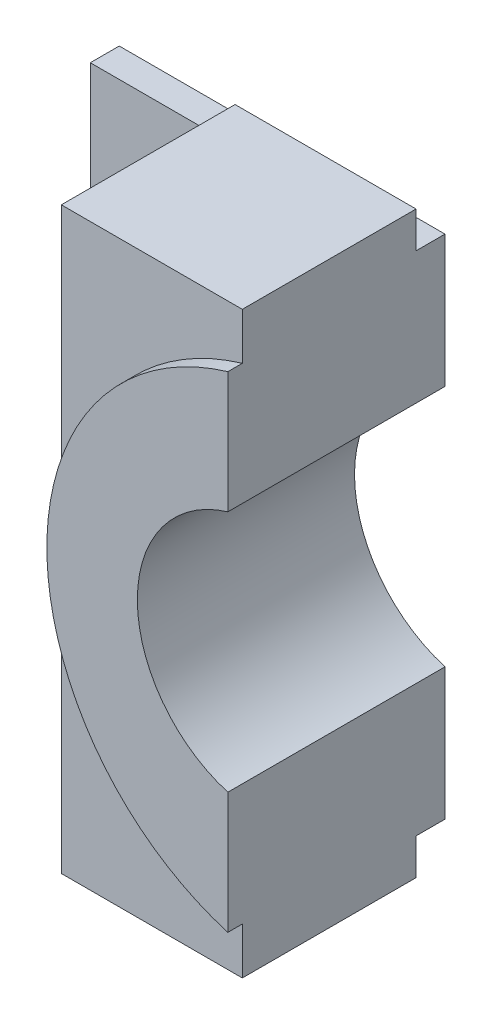
ISO-10303-21;
HEADER;
FILE_DESCRIPTION(('STEP AP214'),'2;1');
FILE_NAME('part.step','',(''),(''),'','','');
FILE_SCHEMA(('AUTOMOTIVE_DESIGN { 1 0 10303 214 1 1 1 1 }'));
ENDSEC;
DATA;
#1=APPLICATION_CONTEXT('core data for automotive mechanical design processes');
#2=APPLICATION_PROTOCOL_DEFINITION('international standard','automotive_design',2000,#1);
#3=PRODUCT_CONTEXT('',#1,'mechanical');
#4=PRODUCT('Part','Part','',(#3));
#5=PRODUCT_RELATED_PRODUCT_CATEGORY('part','',(#4));
#6=PRODUCT_DEFINITION_FORMATION('','',#4);
#7=PRODUCT_DEFINITION_CONTEXT('part definition',#1,'design');
#8=PRODUCT_DEFINITION('design','',#6,#7);
#9=PRODUCT_DEFINITION_SHAPE('','',#8);
#10=(LENGTH_UNIT() NAMED_UNIT(*) SI_UNIT(.MILLI.,.METRE.));
#11=(NAMED_UNIT(*) PLANE_ANGLE_UNIT() SI_UNIT($,.RADIAN.));
#12=(NAMED_UNIT(*) SI_UNIT($,.STERADIAN.) SOLID_ANGLE_UNIT());
#13=UNCERTAINTY_MEASURE_WITH_UNIT(LENGTH_MEASURE(1.E-05),#10,'distance_accuracy_value','');
#14=(GEOMETRIC_REPRESENTATION_CONTEXT(3) GLOBAL_UNCERTAINTY_ASSIGNED_CONTEXT((#13)) GLOBAL_UNIT_ASSIGNED_CONTEXT((#10,
#11,#12)) REPRESENTATION_CONTEXT('',''));
#15=CARTESIAN_POINT('',(0.,0.,0.));
#16=DIRECTION('',(0.,0.,1.));
#17=DIRECTION('',(1.,0.,0.));
#18=AXIS2_PLACEMENT_3D('',#15,#16,#17);
#19=CARTESIAN_POINT('',(2.14999999961,9.70000000075,0.997560739801));
#20=DIRECTION('',(0.,0.,1.));
#21=DIRECTION('',(1.,8.1660348554033E-12,0.));
#22=AXIS2_PLACEMENT_3D('',#19,#20,#21);
#23=CYLINDRICAL_SURFACE('',#22,0.175);
#24=CARTESIAN_POINT('',(2.14999999961,9.70000000075,0.0199999999183009));
#25=DIRECTION('',(4.66852296906889E-10,6.26358125195821E-10,1.));
#26=DIRECTION('',(-1.,0.,4.66852296906889E-10));
#27=AXIS2_PLACEMENT_3D('',#24,#25,#26);
#28=CIRCLE('',#27,0.175);
#29=CARTESIAN_POINT('',(2.09999999961,9.86770509854,0.0199999992549));
#30=VERTEX_POINT('',#29);
#31=CARTESIAN_POINT('',(2.09999999961,9.53229490221,0.0199999992549));
#32=VERTEX_POINT('',#31);
#33=EDGE_CURVE('E11',#30,#32,#28,.T.);
#34=ORIENTED_EDGE('',*,*,#33,.F.);
#35=DIRECTION('',(0.,0.,1.));
#36=VECTOR('',#35,1.);
#37=CARTESIAN_POINT('',(2.09999999961,9.86770509906,0.997560739517));
#38=LINE('',#37,#36);
#39=CARTESIAN_POINT('',(2.09999999961,9.86770509854,0.32));
#40=VERTEX_POINT('',#39);
#41=EDGE_CURVE('E25',#30,#40,#38,.T.);
#42=ORIENTED_EDGE('',*,*,#41,.T.);
#43=CARTESIAN_POINT('',(2.14999999961,9.70000000075,0.320000000291));
#44=DIRECTION('',(-1.66285715355991E-09,-2.23095698132496E-09,1.));
#45=DIRECTION('',(-1.,0.,-1.66285715355991E-09));
#46=AXIS2_PLACEMENT_3D('',#43,#44,#45);
#47=CIRCLE('',#46,0.175);
#48=CARTESIAN_POINT('',(2.09999999961,9.53229490221,0.32));
#49=VERTEX_POINT('',#48);
#50=EDGE_CURVE('E291',#40,#49,#47,.T.);
#51=ORIENTED_EDGE('',*,*,#50,.T.);
#52=DIRECTION('',(0.,0.,1.));
#53=VECTOR('',#52,1.);
#54=CARTESIAN_POINT('',(2.09999999961,9.53229490243,0.997560739517));
#55=LINE('',#54,#53);
#56=EDGE_CURVE('E286',#32,#49,#55,.T.);
#57=ORIENTED_EDGE('',*,*,#56,.F.);
#58=EDGE_LOOP('',(#34,#42,#51,#57));
#59=FACE_BOUND('',#58,.T.);
#60=ADVANCED_FACE('F17',(#59),#23,.F.);
#61=CARTESIAN_POINT('',(2.09999999961,9.35000000075,0.32));
#62=DIRECTION('',(-1.,0.,0.));
#63=DIRECTION('',(0.,0.,-1.));
#64=AXIS2_PLACEMENT_3D('',#61,#62,#63);
#65=PLANE('',#64);
#66=DIRECTION('',(-2.35471780962726E-08,7.02043978506594E-09,-1.));
#67=VECTOR('',#66,1.);
#68=CARTESIAN_POINT('',(2.10000000008232,9.36458980398421,0.32));
#69=LINE('',#68,#67);
#70=CARTESIAN_POINT('',(2.09999999961,9.36458980412,0.32));
#71=VERTEX_POINT('',#70);
#72=CARTESIAN_POINT('',(2.09999999961,9.36458980412,0.3));
#73=VERTEX_POINT('',#72);
#74=EDGE_CURVE('E282',#71,#73,#69,.T.);
#75=ORIENTED_EDGE('',*,*,#74,.T.);
#76=DIRECTION('',(0.,1.,0.));
#77=VECTOR('',#76,1.);
#78=CARTESIAN_POINT('',(2.09999999961,9.33229490206,0.3));
#79=LINE('',#78,#77);
#80=CARTESIAN_POINT('',(2.09999999961,9.3,0.3));
#81=VERTEX_POINT('',#80);
#82=EDGE_CURVE('E277',#81,#73,#79,.T.);
#83=ORIENTED_EDGE('',*,*,#82,.F.);
#84=DIRECTION('',(0.,0.,-1.));
#85=VECTOR('',#84,1.);
#86=CARTESIAN_POINT('',(2.09999999961,9.3,0.180000000112));
#87=LINE('',#86,#85);
#88=CARTESIAN_POINT('',(2.09999999961,9.3,0.0600000002235));
#89=VERTEX_POINT('',#88);
#90=EDGE_CURVE('E273',#81,#89,#87,.T.);
#91=ORIENTED_EDGE('',*,*,#90,.T.);
#92=DIRECTION('',(0.,1.,0.));
#93=VECTOR('',#92,1.);
#94=CARTESIAN_POINT('',(2.09999999961,9.32500000037,0.06));
#95=LINE('',#94,#93);
#96=CARTESIAN_POINT('',(2.09999999961,9.35000000075,0.0600000002235));
#97=VERTEX_POINT('',#96);
#98=EDGE_CURVE('E269',#89,#97,#95,.T.);
#99=ORIENTED_EDGE('',*,*,#98,.T.);
#100=DIRECTION('',(0.,0.,-1.));
#101=VECTOR('',#100,1.);
#102=CARTESIAN_POINT('',(2.09999999961,9.35000000075,0.0399999997392));
#103=LINE('',#102,#101);
#104=CARTESIAN_POINT('',(2.09999999961,9.35000000099667,0.0199999997516333));
#105=VERTEX_POINT('',#104);
#106=EDGE_CURVE('E265',#97,#105,#103,.T.);
#107=ORIENTED_EDGE('',*,*,#106,.T.);
#108=DIRECTION('',(0.,1.,0.));
#109=VECTOR('',#108,1.);
#110=CARTESIAN_POINT('',(2.09999999961,9.44114745222,0.02));
#111=LINE('',#110,#109);
#112=EDGE_CURVE('E260',#105,#32,#111,.T.);
#113=ORIENTED_EDGE('',*,*,#112,.T.);
#114=ORIENTED_EDGE('',*,*,#56,.T.);
#115=DIRECTION('',(0.,1.,0.));
#116=VECTOR('',#115,1.);
#117=CARTESIAN_POINT('',(2.09999999961,9.44844235279,0.32));
#118=LINE('',#117,#116);
#119=EDGE_CURVE('E255',#71,#49,#118,.T.);
#120=ORIENTED_EDGE('',*,*,#119,.F.);
#121=EDGE_LOOP('',(#75,#83,#91,#99,#107,#113,#114,#120));
#122=FACE_BOUND('',#121,.T.);
#123=ADVANCED_FACE('F305',(#122),#65,.F.);
#124=CARTESIAN_POINT('',(2.09999999961,10.0500000007,0.32));
#125=DIRECTION('',(0.,0.,1.));
#126=DIRECTION('',(-1.,0.,0.));
#127=AXIS2_PLACEMENT_3D('',#124,#125,#126);
#128=PLANE('',#127);
#129=CARTESIAN_POINT('',(2.19999999961,9.70000000075,0.32));
#130=DIRECTION('',(0.,0.,1.));
#131=DIRECTION('',(-1.,0.,0.));
#132=AXIS2_PLACEMENT_3D('',#129,#130,#131);
#133=CIRCLE('',#132,0.35);
#134=CARTESIAN_POINT('',(2.09999999961,10.0354101974,0.32));
#135=VERTEX_POINT('',#134);
#136=EDGE_CURVE('E250',#135,#71,#133,.T.);
#137=ORIENTED_EDGE('',*,*,#136,.T.);
#138=ORIENTED_EDGE('',*,*,#119,.T.);
#139=ORIENTED_EDGE('',*,*,#50,.F.);
#140=DIRECTION('',(0.,1.,0.));
#141=VECTOR('',#140,1.);
#142=CARTESIAN_POINT('',(2.09999999961,9.9515576487,0.32));
#143=LINE('',#142,#141);
#144=EDGE_CURVE('E246',#40,#135,#143,.T.);
#145=ORIENTED_EDGE('',*,*,#144,.T.);
#146=EDGE_LOOP('',(#137,#138,#139,#145));
#147=FACE_BOUND('',#146,.T.);
#148=ADVANCED_FACE('F301',(#147),#128,.T.);
#149=CARTESIAN_POINT('',(2.09999999961,9.35000000075,0.32));
#150=DIRECTION('',(-1.,0.,0.));
#151=DIRECTION('',(0.,0.,-1.));
#152=AXIS2_PLACEMENT_3D('',#149,#150,#151);
#153=PLANE('',#152);
#154=DIRECTION('',(0.,1.,0.));
#155=VECTOR('',#154,1.);
#156=CARTESIAN_POINT('',(2.09999999961,10.0677050991,0.3));
#157=LINE('',#156,#155);
#158=CARTESIAN_POINT('',(2.09999999961,10.0354101974,0.3));
#159=VERTEX_POINT('',#158);
#160=CARTESIAN_POINT('',(2.09999999961,10.1000000007,0.3));
#161=VERTEX_POINT('',#160);
#162=EDGE_CURVE('E241',#159,#161,#157,.T.);
#163=ORIENTED_EDGE('',*,*,#162,.F.);
#164=DIRECTION('',(0.,5.67865754419E-09,-1.));
#165=VECTOR('',#164,1.);
#166=CARTESIAN_POINT('',(2.09999999961,10.0354101973,0.31));
#167=LINE('',#166,#165);
#168=EDGE_CURVE('E236',#135,#159,#167,.T.);
#169=ORIENTED_EDGE('',*,*,#168,.F.);
#170=ORIENTED_EDGE('',*,*,#144,.F.);
#171=ORIENTED_EDGE('',*,*,#41,.F.);
#172=DIRECTION('',(0.,1.,0.));
#173=VECTOR('',#172,1.);
#174=CARTESIAN_POINT('',(2.09999999961,9.95885255001,0.02));
#175=LINE('',#174,#173);
#176=CARTESIAN_POINT('',(2.09999999961,10.0500000004667,0.0199999997516333));
#177=VERTEX_POINT('',#176);
#178=EDGE_CURVE('E232',#30,#177,#175,.T.);
#179=ORIENTED_EDGE('',*,*,#178,.T.);
#180=DIRECTION('',(0.,0.,-1.));
#181=VECTOR('',#180,1.);
#182=CARTESIAN_POINT('',(2.09999999961,10.0500000007,0.0399999997392));
#183=LINE('',#182,#181);
#184=CARTESIAN_POINT('',(2.09999999961,10.05,0.0600000002235));
#185=VERTEX_POINT('',#184);
#186=EDGE_CURVE('E228',#185,#177,#183,.T.);
#187=ORIENTED_EDGE('',*,*,#186,.F.);
#188=DIRECTION('',(0.,1.,0.));
#189=VECTOR('',#188,1.);
#190=CARTESIAN_POINT('',(2.09999999961,10.0750000004,0.06));
#191=LINE('',#190,#189);
#192=CARTESIAN_POINT('',(2.09999999961,10.1000000007,0.0600000002235));
#193=VERTEX_POINT('',#192);
#194=EDGE_CURVE('E224',#185,#193,#191,.T.);
#195=ORIENTED_EDGE('',*,*,#194,.T.);
#196=DIRECTION('',(0.,0.,-1.));
#197=VECTOR('',#196,1.);
#198=CARTESIAN_POINT('',(2.09999999961,10.1000000007,0.180000000112));
#199=LINE('',#198,#197);
#200=EDGE_CURVE('E219',#161,#193,#199,.T.);
#201=ORIENTED_EDGE('',*,*,#200,.F.);
#202=EDGE_LOOP('',(#163,#169,#170,#171,#179,#187,#195,#201));
#203=FACE_BOUND('',#202,.T.);
#204=ADVANCED_FACE('F313',(#203),#153,.F.);
#205=CARTESIAN_POINT('',(2.09999999961,10.1000000007,0.32));
#206=DIRECTION('',(0.,-1.,0.));
#207=DIRECTION('',(0.,0.,1.));
#208=AXIS2_PLACEMENT_3D('',#205,#206,#207);
#209=PLANE('',#208);
#210=DIRECTION('',(1.,0.,0.));
#211=VECTOR('',#210,1.);
#212=CARTESIAN_POINT('',(1.97499999961,10.1000000007,0.3));
#213=LINE('',#212,#211);
#214=CARTESIAN_POINT('',(1.84999999961,10.1000000015,0.3));
#215=VERTEX_POINT('',#214);
#216=EDGE_CURVE('E214',#215,#161,#213,.T.);
#217=ORIENTED_EDGE('',*,*,#216,.T.);
#218=ORIENTED_EDGE('',*,*,#200,.T.);
#219=DIRECTION('',(-1.,0.,0.));
#220=VECTOR('',#219,1.);
#221=CARTESIAN_POINT('',(1.97499999961,10.1000000007,0.06));
#222=LINE('',#221,#220);
#223=CARTESIAN_POINT('',(1.84999999961,10.1000000015,0.0600000002235));
#224=VERTEX_POINT('',#223);
#225=EDGE_CURVE('E210',#193,#224,#222,.T.);
#226=ORIENTED_EDGE('',*,*,#225,.T.);
#227=DIRECTION('',(0.,0.,-1.));
#228=VECTOR('',#227,1.);
#229=CARTESIAN_POINT('',(1.84999999961,10.1000000015,0.180000000112));
#230=LINE('',#229,#228);
#231=EDGE_CURVE('E205',#215,#224,#230,.T.);
#232=ORIENTED_EDGE('',*,*,#231,.F.);
#233=EDGE_LOOP('',(#217,#218,#226,#232));
#234=FACE_BOUND('',#233,.T.);
#235=ADVANCED_FACE('F358',(#234),#209,.F.);
#236=CARTESIAN_POINT('',(1.84999999961,10.0500000007,0.32));
#237=DIRECTION('',(1.,0.,0.));
#238=DIRECTION('',(0.,0.,1.));
#239=AXIS2_PLACEMENT_3D('',#236,#237,#238);
#240=PLANE('',#239);
#241=DIRECTION('',(0.,1.,0.));
#242=VECTOR('',#241,1.);
#243=CARTESIAN_POINT('',(1.84999999961,9.50000000075,0.3));
#244=LINE('',#243,#242);
#245=CARTESIAN_POINT('',(1.84999999961,9.30000000075,0.3));
#246=VERTEX_POINT('',#245);
#247=CARTESIAN_POINT('',(1.84999999961,9.70000000075,0.3));
#248=VERTEX_POINT('',#247);
#249=EDGE_CURVE('E201',#246,#248,#244,.T.);
#250=ORIENTED_EDGE('',*,*,#249,.T.);
#251=DIRECTION('',(0.,1.,0.));
#252=VECTOR('',#251,1.);
#253=CARTESIAN_POINT('',(1.84999999961,9.90000000112,0.3));
#254=LINE('',#253,#252);
#255=EDGE_CURVE('E196',#248,#215,#254,.T.);
#256=ORIENTED_EDGE('',*,*,#255,.T.);
#257=ORIENTED_EDGE('',*,*,#231,.T.);
#258=DIRECTION('',(0.,-1.,0.));
#259=VECTOR('',#258,1.);
#260=CARTESIAN_POINT('',(1.84999999961,10.0750000004,0.06));
#261=LINE('',#260,#259);
#262=CARTESIAN_POINT('',(1.84999999961,10.0500000007,0.06));
#263=VERTEX_POINT('',#262);
#264=EDGE_CURVE('E192',#224,#263,#261,.T.);
#265=ORIENTED_EDGE('',*,*,#264,.T.);
#266=DIRECTION('',(0.,1.,0.));
#267=VECTOR('',#266,1.);
#268=CARTESIAN_POINT('',(1.84999999961,9.70000000112,0.06));
#269=LINE('',#268,#267);
#270=CARTESIAN_POINT('',(1.84999999961,9.35000000149,0.06));
#271=VERTEX_POINT('',#270);
#272=EDGE_CURVE('E135',#271,#263,#269,.T.);
#273=ORIENTED_EDGE('',*,*,#272,.F.);
#274=DIRECTION('',(0.,-1.,0.));
#275=VECTOR('',#274,1.);
#276=CARTESIAN_POINT('',(1.84999999961,9.32500000037,0.06));
#277=LINE('',#276,#275);
#278=CARTESIAN_POINT('',(1.84999999961,9.3,0.06));
#279=VERTEX_POINT('',#278);
#280=EDGE_CURVE('E185',#271,#279,#277,.T.);
#281=ORIENTED_EDGE('',*,*,#280,.T.);
#282=DIRECTION('',(0.,0.,-1.));
#283=VECTOR('',#282,1.);
#284=CARTESIAN_POINT('',(1.84999999961,9.30000000075,0.180000000112));
#285=LINE('',#284,#283);
#286=EDGE_CURVE('E180',#246,#279,#285,.T.);
#287=ORIENTED_EDGE('',*,*,#286,.F.);
#288=EDGE_LOOP('',(#250,#256,#257,#265,#273,#281,#287));
#289=FACE_BOUND('',#288,.T.);
#290=ADVANCED_FACE('F361',(#289),#240,.F.);
#291=CARTESIAN_POINT('',(1.84999999961,9.30000000075,0.32));
#292=DIRECTION('',(0.,1.,0.));
#293=DIRECTION('',(0.,0.,-1.));
#294=AXIS2_PLACEMENT_3D('',#291,#292,#293);
#295=PLANE('',#294);
#296=DIRECTION('',(1.,0.,0.));
#297=VECTOR('',#296,1.);
#298=CARTESIAN_POINT('',(1.97499999961,9.30000000075,0.3));
#299=LINE('',#298,#297);
#300=EDGE_CURVE('E175',#246,#81,#299,.T.);
#301=ORIENTED_EDGE('',*,*,#300,.F.);
#302=ORIENTED_EDGE('',*,*,#286,.T.);
#303=DIRECTION('',(1.,0.,0.));
#304=VECTOR('',#303,1.);
#305=CARTESIAN_POINT('',(1.97499999961,9.3,0.06));
#306=LINE('',#305,#304);
#307=EDGE_CURVE('E170',#279,#89,#306,.T.);
#308=ORIENTED_EDGE('',*,*,#307,.T.);
#309=ORIENTED_EDGE('',*,*,#90,.F.);
#310=EDGE_LOOP('',(#301,#302,#308,#309));
#311=FACE_BOUND('',#310,.T.);
#312=ADVANCED_FACE('F328',(#311),#295,.F.);
#313=CARTESIAN_POINT('',(2.09999999961,10.1000000007,0.06));
#314=DIRECTION('',(0.,0.,1.));
#315=DIRECTION('',(-1.,0.,0.));
#316=AXIS2_PLACEMENT_3D('',#313,#314,#315);
#317=PLANE('',#316);
#318=ORIENTED_EDGE('',*,*,#280,.F.);
#319=DIRECTION('',(1.,0.,0.));
#320=VECTOR('',#319,1.);
#321=CARTESIAN_POINT('',(1.97499999961,9.35000000075,0.0600000002235));
#322=LINE('',#321,#320);
#323=EDGE_CURVE('E165',#271,#97,#322,.T.);
#324=ORIENTED_EDGE('',*,*,#323,.T.);
#325=ORIENTED_EDGE('',*,*,#98,.F.);
#326=ORIENTED_EDGE('',*,*,#307,.F.);
#327=EDGE_LOOP('',(#318,#324,#325,#326));
#328=FACE_BOUND('',#327,.T.);
#329=ADVANCED_FACE('F334',(#328),#317,.F.);
#330=CARTESIAN_POINT('',(1.84999999961,9.35000000075,0.32));
#331=DIRECTION('',(0.,1.,0.));
#332=DIRECTION('',(0.,0.,-1.));
#333=AXIS2_PLACEMENT_3D('',#330,#331,#332);
#334=PLANE('',#333);
#335=ORIENTED_EDGE('',*,*,#323,.F.);
#336=DIRECTION('',(1.,0.,0.));
#337=VECTOR('',#336,1.);
#338=CARTESIAN_POINT('',(1.74999999998,9.35000000075,0.0600000002235));
#339=LINE('',#338,#337);
#340=CARTESIAN_POINT('',(1.65000000035,9.35000000149,0.06));
#341=VERTEX_POINT('',#340);
#342=EDGE_CURVE('E161',#341,#271,#339,.T.);
#343=ORIENTED_EDGE('',*,*,#342,.F.);
#344=DIRECTION('',(0.,0.,-1.));
#345=VECTOR('',#344,1.);
#346=CARTESIAN_POINT('',(1.65000000035,9.35000000075,0.0399999997392));
#347=LINE('',#346,#345);
#348=CARTESIAN_POINT('',(1.65000000010333,9.35000000124333,0.0200000002980333));
#349=VERTEX_POINT('',#348);
#350=EDGE_CURVE('E128',#341,#349,#347,.T.);
#351=ORIENTED_EDGE('',*,*,#350,.T.);
#352=DIRECTION('',(1.,0.,0.));
#353=VECTOR('',#352,1.);
#354=CARTESIAN_POINT('',(1.87499999998,9.35000000149,0.02));
#355=LINE('',#354,#353);
#356=EDGE_CURVE('E153',#349,#105,#355,.T.);
#357=ORIENTED_EDGE('',*,*,#356,.T.);
#358=ORIENTED_EDGE('',*,*,#106,.F.);
#359=EDGE_LOOP('',(#335,#343,#351,#357,#358));
#360=FACE_BOUND('',#359,.T.);
#361=ADVANCED_FACE('F336',(#360),#334,.F.);
#362=CARTESIAN_POINT('',(2.09999999961,10.0500000007,0.02));
#363=DIRECTION('',(0.,0.,1.));
#364=DIRECTION('',(-1.,0.,0.));
#365=AXIS2_PLACEMENT_3D('',#362,#363,#364);
#366=PLANE('',#365);
#367=ORIENTED_EDGE('',*,*,#178,.F.);
#368=ORIENTED_EDGE('',*,*,#33,.T.);
#369=ORIENTED_EDGE('',*,*,#112,.F.);
#370=ORIENTED_EDGE('',*,*,#356,.F.);
#371=DIRECTION('',(0.,-1.,0.));
#372=VECTOR('',#371,1.);
#373=CARTESIAN_POINT('',(1.65000000035,9.70000000112,0.02));
#374=LINE('',#373,#372);
#375=CARTESIAN_POINT('',(1.65000000035,10.0500000007,0.0199999992549));
#376=VERTEX_POINT('',#375);
#377=EDGE_CURVE('E149',#376,#349,#374,.T.);
#378=ORIENTED_EDGE('',*,*,#377,.F.);
#379=DIRECTION('',(-1.,0.,0.));
#380=VECTOR('',#379,1.);
#381=CARTESIAN_POINT('',(1.87499999998,10.0500000007,0.02));
#382=LINE('',#381,#380);
#383=EDGE_CURVE('E119',#177,#376,#382,.T.);
#384=ORIENTED_EDGE('',*,*,#383,.F.);
#385=EDGE_LOOP('',(#367,#368,#369,#370,#378,#384));
#386=FACE_BOUND('',#385,.T.);
#387=ADVANCED_FACE('F311',(#386),#366,.F.);
#388=CARTESIAN_POINT('',(2.09999999961,10.0500000007,0.32));
#389=DIRECTION('',(0.,-1.,0.));
#390=DIRECTION('',(0.,0.,1.));
#391=AXIS2_PLACEMENT_3D('',#388,#389,#390);
#392=PLANE('',#391);
#393=DIRECTION('',(-1.,0.,0.));
#394=VECTOR('',#393,1.);
#395=CARTESIAN_POINT('',(1.97499999961,10.0500000007,0.0600000002235));
#396=LINE('',#395,#394);
#397=EDGE_CURVE('E122',#185,#263,#396,.T.);
#398=ORIENTED_EDGE('',*,*,#397,.F.);
#399=ORIENTED_EDGE('',*,*,#186,.T.);
#400=ORIENTED_EDGE('',*,*,#383,.T.);
#401=DIRECTION('',(0.,0.,-1.));
#402=VECTOR('',#401,1.);
#403=CARTESIAN_POINT('',(1.65000000035,10.0500000007,0.0399999997392));
#404=LINE('',#403,#402);
#405=CARTESIAN_POINT('',(1.65000000035,10.0500000007,0.06));
#406=VERTEX_POINT('',#405);
#407=EDGE_CURVE('E111',#406,#376,#404,.T.);
#408=ORIENTED_EDGE('',*,*,#407,.F.);
#409=DIRECTION('',(-1.,0.,0.));
#410=VECTOR('',#409,1.);
#411=CARTESIAN_POINT('',(1.74999999998,10.0500000007,0.0600000002235));
#412=LINE('',#411,#410);
#413=EDGE_CURVE('E116',#263,#406,#412,.T.);
#414=ORIENTED_EDGE('',*,*,#413,.F.);
#415=EDGE_LOOP('',(#398,#399,#400,#408,#414));
#416=FACE_BOUND('',#415,.T.);
#417=ADVANCED_FACE('F114',(#416),#392,.F.);
#418=CARTESIAN_POINT('',(1.84999999961,10.0500000007,0.06));
#419=DIRECTION('',(0.,0.,1.));
#420=DIRECTION('',(-1.,0.,0.));
#421=AXIS2_PLACEMENT_3D('',#418,#419,#420);
#422=PLANE('',#421);
#423=ORIENTED_EDGE('',*,*,#272,.T.);
#424=ORIENTED_EDGE('',*,*,#413,.T.);
#425=DIRECTION('',(0.,-1.,0.));
#426=VECTOR('',#425,1.);
#427=CARTESIAN_POINT('',(1.64999999961,9.70000000112,0.06));
#428=LINE('',#427,#426);
#429=EDGE_CURVE('E126',#406,#341,#428,.T.);
#430=ORIENTED_EDGE('',*,*,#429,.T.);
#431=ORIENTED_EDGE('',*,*,#342,.T.);
#432=EDGE_LOOP('',(#423,#424,#430,#431));
#433=FACE_BOUND('',#432,.T.);
#434=ADVANCED_FACE('F134',(#433),#422,.T.);
#435=CARTESIAN_POINT('',(1.64999999961,10.0500000007,0.06));
#436=DIRECTION('',(1.,0.,0.));
#437=DIRECTION('',(0.,0.,1.));
#438=AXIS2_PLACEMENT_3D('',#435,#436,#437);
#439=PLANE('',#438);
#440=ORIENTED_EDGE('',*,*,#377,.T.);
#441=ORIENTED_EDGE('',*,*,#350,.F.);
#442=ORIENTED_EDGE('',*,*,#429,.F.);
#443=ORIENTED_EDGE('',*,*,#407,.T.);
#444=EDGE_LOOP('',(#440,#441,#442,#443));
#445=FACE_BOUND('',#444,.T.);
#446=ADVANCED_FACE('F127',(#445),#439,.F.);
#447=CARTESIAN_POINT('',(2.09999999961,10.1000000007,0.06));
#448=DIRECTION('',(0.,0.,1.));
#449=DIRECTION('',(-1.,0.,0.));
#450=AXIS2_PLACEMENT_3D('',#447,#448,#449);
#451=PLANE('',#450);
#452=ORIENTED_EDGE('',*,*,#194,.F.);
#453=ORIENTED_EDGE('',*,*,#397,.T.);
#454=ORIENTED_EDGE('',*,*,#264,.F.);
#455=ORIENTED_EDGE('',*,*,#225,.F.);
#456=EDGE_LOOP('',(#452,#453,#454,#455));
#457=FACE_BOUND('',#456,.T.);
#458=ADVANCED_FACE('F418',(#457),#451,.F.);
#459=CARTESIAN_POINT('',(1.29999999961,9.70000000075,0.3));
#460=DIRECTION('',(0.,0.,1.));
#461=DIRECTION('',(-1.,0.,0.));
#462=AXIS2_PLACEMENT_3D('',#459,#460,#461);
#463=PLANE('',#462);
#464=ORIENTED_EDGE('',*,*,#249,.F.);
#465=ORIENTED_EDGE('',*,*,#300,.T.);
#466=ORIENTED_EDGE('',*,*,#82,.T.);
#467=CARTESIAN_POINT('',(2.19999999961,9.70000000075,0.3));
#468=DIRECTION('',(0.,0.,1.));
#469=DIRECTION('',(-1.,0.,0.));
#470=AXIS2_PLACEMENT_3D('',#467,#468,#469);
#471=CIRCLE('',#470,0.35);
#472=EDGE_CURVE('E131',#248,#73,#471,.T.);
#473=ORIENTED_EDGE('',*,*,#472,.F.);
#474=EDGE_LOOP('',(#464,#465,#466,#473));
#475=FACE_BOUND('',#474,.T.);
#476=ADVANCED_FACE('F324',(#475),#463,.T.);
#477=CARTESIAN_POINT('',(2.19999999961,9.70000000075,0.31));
#478=DIRECTION('',(0.,0.,1.));
#479=DIRECTION('',(1.,7.11515934378732E-10,0.));
#480=AXIS2_PLACEMENT_3D('',#477,#478,#479);
#481=CYLINDRICAL_SURFACE('',#480,0.35);
#482=CARTESIAN_POINT('',(2.19999999961,9.70000000075,0.3));
#483=DIRECTION('',(0.,0.,1.));
#484=DIRECTION('',(-1.,0.,0.));
#485=AXIS2_PLACEMENT_3D('',#482,#483,#484);
#486=CIRCLE('',#485,0.35);
#487=EDGE_CURVE('E458',#159,#248,#486,.T.);
#488=ORIENTED_EDGE('',*,*,#487,.T.);
#489=ORIENTED_EDGE('',*,*,#472,.T.);
#490=ORIENTED_EDGE('',*,*,#74,.F.);
#491=ORIENTED_EDGE('',*,*,#136,.F.);
#492=ORIENTED_EDGE('',*,*,#168,.T.);
#493=EDGE_LOOP('',(#488,#489,#490,#491,#492));
#494=FACE_BOUND('',#493,.T.);
#495=ADVANCED_FACE('F319',(#494),#481,.T.);
#496=CARTESIAN_POINT('',(1.29999999961,9.70000000075,0.3));
#497=DIRECTION('',(0.,0.,1.));
#498=DIRECTION('',(-1.,0.,0.));
#499=AXIS2_PLACEMENT_3D('',#496,#497,#498);
#500=PLANE('',#499);
#501=ORIENTED_EDGE('',*,*,#487,.F.);
#502=ORIENTED_EDGE('',*,*,#162,.T.);
#503=ORIENTED_EDGE('',*,*,#216,.F.);
#504=ORIENTED_EDGE('',*,*,#255,.F.);
#505=EDGE_LOOP('',(#501,#502,#503,#504));
#506=FACE_BOUND('',#505,.T.);
#507=ADVANCED_FACE('F444',(#506),#500,.T.);
#508=CLOSED_SHELL('',(#60,#123,#148,#204,#235,#290,#312,#329,#361,#387,#417,#434,#446,#458,#476,
#495,#507));
#509=MANIFOLD_SOLID_BREP('B1',#508);
#510=ADVANCED_BREP_SHAPE_REPRESENTATION('',(#18,#509),#14);
#511=SHAPE_DEFINITION_REPRESENTATION(#9,#510);
ENDSEC;
END-ISO-10303-21;
